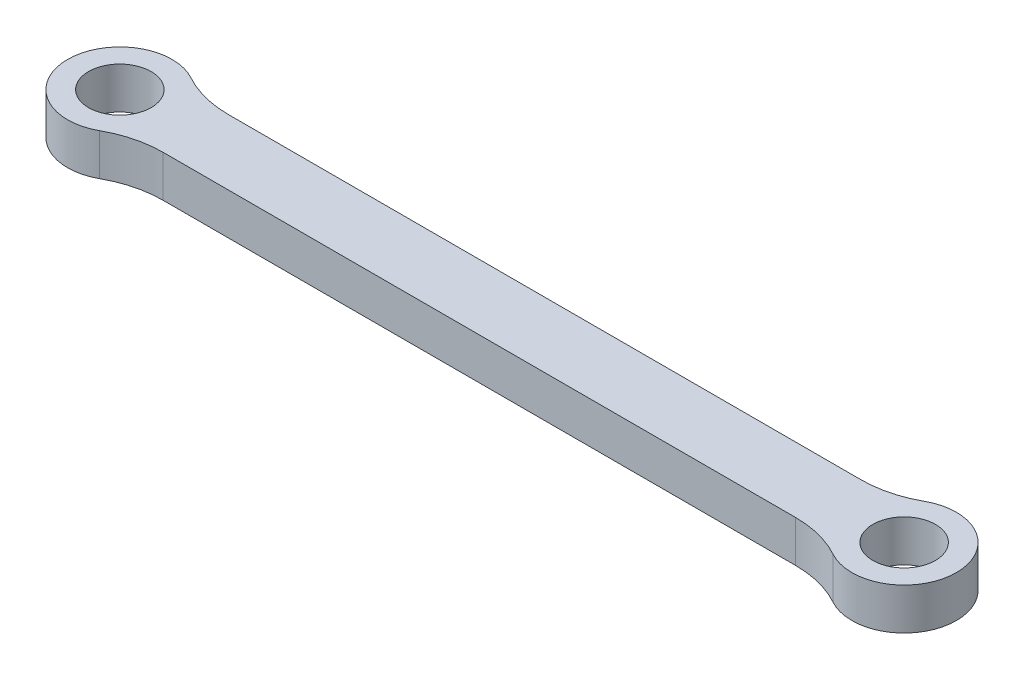
ISO-10303-21;
HEADER;
FILE_DESCRIPTION(('STEP AP214'),'2;1');
FILE_NAME('part.step','',(''),(''),'','','');
FILE_SCHEMA(('AUTOMOTIVE_DESIGN { 1 0 10303 214 1 1 1 1 }'));
ENDSEC;
DATA;
#1=APPLICATION_CONTEXT('core data for automotive mechanical design processes');
#2=APPLICATION_PROTOCOL_DEFINITION('international standard','automotive_design',2000,#1);
#3=PRODUCT_CONTEXT('',#1,'mechanical');
#4=PRODUCT('Part','Part','',(#3));
#5=PRODUCT_RELATED_PRODUCT_CATEGORY('part','',(#4));
#6=PRODUCT_DEFINITION_FORMATION('','',#4);
#7=PRODUCT_DEFINITION_CONTEXT('part definition',#1,'design');
#8=PRODUCT_DEFINITION('design','',#6,#7);
#9=PRODUCT_DEFINITION_SHAPE('','',#8);
#10=(LENGTH_UNIT() NAMED_UNIT(*) SI_UNIT(.MILLI.,.METRE.));
#11=(NAMED_UNIT(*) PLANE_ANGLE_UNIT() SI_UNIT($,.RADIAN.));
#12=(NAMED_UNIT(*) SI_UNIT($,.STERADIAN.) SOLID_ANGLE_UNIT());
#13=UNCERTAINTY_MEASURE_WITH_UNIT(LENGTH_MEASURE(1.E-05),#10,'distance_accuracy_value','');
#14=(GEOMETRIC_REPRESENTATION_CONTEXT(3) GLOBAL_UNCERTAINTY_ASSIGNED_CONTEXT((#13)) GLOBAL_UNIT_ASSIGNED_CONTEXT((#10,
#11,#12)) REPRESENTATION_CONTEXT('',''));
#15=CARTESIAN_POINT('',(0.,0.,0.));
#16=DIRECTION('',(0.,0.,1.));
#17=DIRECTION('',(1.,0.,0.));
#18=AXIS2_PLACEMENT_3D('',#15,#16,#17);
#19=CARTESIAN_POINT('',(-30.,3.18,-2.5));
#20=DIRECTION('',(0.,0.,1.));
#21=DIRECTION('',(1.,0.,0.));
#22=AXIS2_PLACEMENT_3D('',#19,#20,#21);
#23=PLANE('',#22);
#24=DIRECTION('',(-1.,0.,0.));
#25=VECTOR('',#24,1.);
#26=CARTESIAN_POINT('',(-30.,3.18,-2.5));
#27=LINE('',#26,#25);
#28=CARTESIAN_POINT('',(24.1905249806889,3.18,-2.5));
#29=VERTEX_POINT('',#28);
#30=CARTESIAN_POINT('',(-24.1905249806889,3.18,-2.5));
#31=VERTEX_POINT('',#30);
#32=EDGE_CURVE('E115',#29,#31,#27,.T.);
#33=ORIENTED_EDGE('',*,*,#32,.F.);
#34=DIRECTION('',(0.,1.,0.));
#35=VECTOR('',#34,1.);
#36=CARTESIAN_POINT('',(24.1905249806889,0.,-2.5));
#37=LINE('',#36,#35);
#38=CARTESIAN_POINT('',(24.1905249806889,0.,-2.5));
#39=VERTEX_POINT('',#38);
#40=EDGE_CURVE('E171',#29,#39,#37,.F.);
#41=ORIENTED_EDGE('',*,*,#40,.T.);
#42=DIRECTION('',(-1.,0.,0.));
#43=VECTOR('',#42,1.);
#44=CARTESIAN_POINT('',(-30.,0.,-2.5));
#45=LINE('',#44,#43);
#46=CARTESIAN_POINT('',(-24.1905249806889,0.,-2.5));
#47=VERTEX_POINT('',#46);
#48=EDGE_CURVE('E187',#39,#47,#45,.T.);
#49=ORIENTED_EDGE('',*,*,#48,.T.);
#50=DIRECTION('',(0.,1.,0.));
#51=VECTOR('',#50,1.);
#52=CARTESIAN_POINT('',(-24.1905249806889,3.18,-2.5));
#53=LINE('',#52,#51);
#54=EDGE_CURVE('E139',#47,#31,#53,.T.);
#55=ORIENTED_EDGE('',*,*,#54,.T.);
#56=EDGE_LOOP('',(#33,#41,#49,#55));
#57=FACE_BOUND('',#56,.T.);
#58=ADVANCED_FACE('F43',(#57),#23,.F.);
#59=CARTESIAN_POINT('',(-30.,3.18,2.5));
#60=DIRECTION('',(0.,0.,-1.));
#61=DIRECTION('',(-1.,0.,0.));
#62=AXIS2_PLACEMENT_3D('',#59,#60,#61);
#63=PLANE('',#62);
#64=DIRECTION('',(1.,0.,0.));
#65=VECTOR('',#64,1.);
#66=CARTESIAN_POINT('',(-30.,0.,2.5));
#67=LINE('',#66,#65);
#68=CARTESIAN_POINT('',(-24.1905249806889,0.,2.5));
#69=VERTEX_POINT('',#68);
#70=CARTESIAN_POINT('',(24.1905249806889,0.,2.5));
#71=VERTEX_POINT('',#70);
#72=EDGE_CURVE('E147',#69,#71,#67,.T.);
#73=ORIENTED_EDGE('',*,*,#72,.T.);
#74=DIRECTION('',(0.,1.,0.));
#75=VECTOR('',#74,1.);
#76=CARTESIAN_POINT('',(24.1905249806889,3.18,2.5));
#77=LINE('',#76,#75);
#78=CARTESIAN_POINT('',(24.1905249806889,3.18,2.5));
#79=VERTEX_POINT('',#78);
#80=EDGE_CURVE('E65',#71,#79,#77,.T.);
#81=ORIENTED_EDGE('',*,*,#80,.T.);
#82=DIRECTION('',(1.,0.,0.));
#83=VECTOR('',#82,1.);
#84=CARTESIAN_POINT('',(-30.,3.18,2.5));
#85=LINE('',#84,#83);
#86=CARTESIAN_POINT('',(-24.1905249806889,3.18,2.5));
#87=VERTEX_POINT('',#86);
#88=EDGE_CURVE('E140',#87,#79,#85,.T.);
#89=ORIENTED_EDGE('',*,*,#88,.F.);
#90=DIRECTION('',(0.,1.,0.));
#91=VECTOR('',#90,1.);
#92=CARTESIAN_POINT('',(-24.1905249806889,0.,2.5));
#93=LINE('',#92,#91);
#94=EDGE_CURVE('E154',#87,#69,#93,.F.);
#95=ORIENTED_EDGE('',*,*,#94,.T.);
#96=EDGE_LOOP('',(#73,#81,#89,#95));
#97=FACE_BOUND('',#96,.T.);
#98=ADVANCED_FACE('F228',(#97),#63,.F.);
#99=CARTESIAN_POINT('',(0.,3.18,0.));
#100=DIRECTION('',(0.,1.,0.));
#101=DIRECTION('',(0.,0.,1.));
#102=AXIS2_PLACEMENT_3D('',#99,#100,#101);
#103=PLANE('',#102);
#104=CARTESIAN_POINT('',(30.,3.18,0.));
#105=DIRECTION('',(0.,1.,0.));
#106=DIRECTION('',(0.,0.,1.));
#107=AXIS2_PLACEMENT_3D('',#104,#105,#106);
#108=CIRCLE('',#107,2.395);
#109=CARTESIAN_POINT('',(30.,3.18,2.395));
#110=VERTEX_POINT('',#109);
#111=EDGE_CURVE('E134',#110,#110,#108,.T.);
#112=ORIENTED_EDGE('',*,*,#111,.F.);
#113=EDGE_LOOP('',(#112));
#114=FACE_BOUND('',#113,.T.);
#115=CARTESIAN_POINT('',(-30.,3.18,0.));
#116=DIRECTION('',(0.,1.,0.));
#117=DIRECTION('',(0.,0.,1.));
#118=AXIS2_PLACEMENT_3D('',#115,#116,#117);
#119=CIRCLE('',#118,2.395);
#120=CARTESIAN_POINT('',(-30.,3.18,2.395));
#121=VERTEX_POINT('',#120);
#122=EDGE_CURVE('E219',#121,#121,#119,.T.);
#123=ORIENTED_EDGE('',*,*,#122,.F.);
#124=EDGE_LOOP('',(#123));
#125=FACE_BOUND('',#124,.T.);
#126=CARTESIAN_POINT('',(30.,3.18,0.));
#127=DIRECTION('',(0.,1.,0.));
#128=DIRECTION('',(0.,0.,1.));
#129=AXIS2_PLACEMENT_3D('',#126,#127,#128);
#130=CIRCLE('',#129,3.99999999999999);
#131=CARTESIAN_POINT('',(28.0635083268963,3.18,3.49999999999999));
#132=VERTEX_POINT('',#131);
#133=CARTESIAN_POINT('',(28.0635083268963,3.18,-3.5));
#134=VERTEX_POINT('',#133);
#135=EDGE_CURVE('E196',#132,#134,#130,.T.);
#136=ORIENTED_EDGE('',*,*,#135,.T.);
#137=CARTESIAN_POINT('',(24.1905249806889,3.18,-10.5));
#138=DIRECTION('',(0.,1.,0.));
#139=DIRECTION('',(0.,0.,1.));
#140=AXIS2_PLACEMENT_3D('',#137,#138,#139);
#141=CIRCLE('',#140,8.);
#142=EDGE_CURVE('E176',#134,#29,#141,.F.);
#143=ORIENTED_EDGE('',*,*,#142,.T.);
#144=ORIENTED_EDGE('',*,*,#32,.T.);
#145=CARTESIAN_POINT('',(-24.1905249806889,3.18,-10.5));
#146=DIRECTION('',(0.,1.,0.));
#147=DIRECTION('',(0.,0.,1.));
#148=AXIS2_PLACEMENT_3D('',#145,#146,#147);
#149=CIRCLE('',#148,8.);
#150=CARTESIAN_POINT('',(-28.0635083268963,3.18,-3.5));
#151=VERTEX_POINT('',#150);
#152=EDGE_CURVE('E109',#31,#151,#149,.F.);
#153=ORIENTED_EDGE('',*,*,#152,.T.);
#154=CARTESIAN_POINT('',(-30.,3.18,0.));
#155=DIRECTION('',(0.,1.,0.));
#156=DIRECTION('',(0.,0.,1.));
#157=AXIS2_PLACEMENT_3D('',#154,#155,#156);
#158=CIRCLE('',#157,4.);
#159=CARTESIAN_POINT('',(-28.0635083268963,3.18,3.5));
#160=VERTEX_POINT('',#159);
#161=EDGE_CURVE('E113',#151,#160,#158,.T.);
#162=ORIENTED_EDGE('',*,*,#161,.T.);
#163=CARTESIAN_POINT('',(-24.1905249806889,3.18,10.5));
#164=DIRECTION('',(0.,1.,0.));
#165=DIRECTION('',(0.,0.,1.));
#166=AXIS2_PLACEMENT_3D('',#163,#164,#165);
#167=CIRCLE('',#166,8.);
#168=EDGE_CURVE('E157',#160,#87,#167,.F.);
#169=ORIENTED_EDGE('',*,*,#168,.T.);
#170=ORIENTED_EDGE('',*,*,#88,.T.);
#171=CARTESIAN_POINT('',(24.1905249806889,3.18,10.5));
#172=DIRECTION('',(0.,1.,0.));
#173=DIRECTION('',(0.,0.,1.));
#174=AXIS2_PLACEMENT_3D('',#171,#172,#173);
#175=CIRCLE('',#174,8.);
#176=EDGE_CURVE('E11',#79,#132,#175,.F.);
#177=ORIENTED_EDGE('',*,*,#176,.T.);
#178=EDGE_LOOP('',(#136,#143,#144,#153,#162,#169,#170,#177));
#179=FACE_BOUND('',#178,.T.);
#180=ADVANCED_FACE('F112',(#114,#125,#179),#103,.T.);
#181=CARTESIAN_POINT('',(0.,0.,0.));
#182=DIRECTION('',(0.,1.,0.));
#183=DIRECTION('',(0.,0.,1.));
#184=AXIS2_PLACEMENT_3D('',#181,#182,#183);
#185=PLANE('',#184);
#186=CARTESIAN_POINT('',(30.,0.,0.));
#187=DIRECTION('',(0.,1.,0.));
#188=DIRECTION('',(0.,0.,1.));
#189=AXIS2_PLACEMENT_3D('',#186,#187,#188);
#190=CIRCLE('',#189,2.395);
#191=CARTESIAN_POINT('',(30.,0.,2.395));
#192=VERTEX_POINT('',#191);
#193=EDGE_CURVE('E211',#192,#192,#190,.T.);
#194=ORIENTED_EDGE('',*,*,#193,.T.);
#195=EDGE_LOOP('',(#194));
#196=FACE_BOUND('',#195,.T.);
#197=CARTESIAN_POINT('',(-30.,0.,0.));
#198=DIRECTION('',(0.,1.,0.));
#199=DIRECTION('',(0.,0.,1.));
#200=AXIS2_PLACEMENT_3D('',#197,#198,#199);
#201=CIRCLE('',#200,2.395);
#202=CARTESIAN_POINT('',(-30.,0.,2.395));
#203=VERTEX_POINT('',#202);
#204=EDGE_CURVE('E215',#203,#203,#201,.T.);
#205=ORIENTED_EDGE('',*,*,#204,.T.);
#206=EDGE_LOOP('',(#205));
#207=FACE_BOUND('',#206,.T.);
#208=ORIENTED_EDGE('',*,*,#72,.F.);
#209=CARTESIAN_POINT('',(-24.1905249806889,0.,10.5));
#210=DIRECTION('',(0.,1.,0.));
#211=DIRECTION('',(0.,0.,1.));
#212=AXIS2_PLACEMENT_3D('',#209,#210,#211);
#213=CIRCLE('',#212,8.);
#214=CARTESIAN_POINT('',(-28.0635083268963,0.,3.5));
#215=VERTEX_POINT('',#214);
#216=EDGE_CURVE('E160',#69,#215,#213,.T.);
#217=ORIENTED_EDGE('',*,*,#216,.T.);
#218=CARTESIAN_POINT('',(-30.,0.,0.));
#219=DIRECTION('',(0.,1.,0.));
#220=DIRECTION('',(0.,0.,1.));
#221=AXIS2_PLACEMENT_3D('',#218,#219,#220);
#222=CIRCLE('',#221,4.);
#223=CARTESIAN_POINT('',(-28.0635083268963,0.,-3.5));
#224=VERTEX_POINT('',#223);
#225=EDGE_CURVE('E133',#224,#215,#222,.T.);
#226=ORIENTED_EDGE('',*,*,#225,.F.);
#227=CARTESIAN_POINT('',(-24.1905249806889,0.,-10.5));
#228=DIRECTION('',(0.,1.,0.));
#229=DIRECTION('',(0.,0.,1.));
#230=AXIS2_PLACEMENT_3D('',#227,#228,#229);
#231=CIRCLE('',#230,8.);
#232=EDGE_CURVE('E122',#224,#47,#231,.T.);
#233=ORIENTED_EDGE('',*,*,#232,.T.);
#234=ORIENTED_EDGE('',*,*,#48,.F.);
#235=CARTESIAN_POINT('',(24.1905249806889,0.,-10.5));
#236=DIRECTION('',(0.,1.,0.));
#237=DIRECTION('',(0.,0.,1.));
#238=AXIS2_PLACEMENT_3D('',#235,#236,#237);
#239=CIRCLE('',#238,8.);
#240=CARTESIAN_POINT('',(28.0635083268963,0.,-3.5));
#241=VERTEX_POINT('',#240);
#242=EDGE_CURVE('E179',#39,#241,#239,.T.);
#243=ORIENTED_EDGE('',*,*,#242,.T.);
#244=CARTESIAN_POINT('',(30.,0.,0.));
#245=DIRECTION('',(0.,1.,0.));
#246=DIRECTION('',(0.,0.,1.));
#247=AXIS2_PLACEMENT_3D('',#244,#245,#246);
#248=CIRCLE('',#247,3.99999999999999);
#249=CARTESIAN_POINT('',(28.0635083268963,0.,3.49999999999999));
#250=VERTEX_POINT('',#249);
#251=EDGE_CURVE('E186',#250,#241,#248,.T.);
#252=ORIENTED_EDGE('',*,*,#251,.F.);
#253=CARTESIAN_POINT('',(24.1905249806889,0.,10.5));
#254=DIRECTION('',(0.,1.,0.));
#255=DIRECTION('',(0.,0.,1.));
#256=AXIS2_PLACEMENT_3D('',#253,#254,#255);
#257=CIRCLE('',#256,8.);
#258=EDGE_CURVE('E52',#250,#71,#257,.T.);
#259=ORIENTED_EDGE('',*,*,#258,.T.);
#260=EDGE_LOOP('',(#208,#217,#226,#233,#234,#243,#252,#259));
#261=FACE_BOUND('',#260,.T.);
#262=ADVANCED_FACE('F185',(#196,#207,#261),#185,.F.);
#263=CARTESIAN_POINT('',(30.,14.4937084989848,0.));
#264=DIRECTION('',(0.,-1.,0.));
#265=DIRECTION('',(0.,0.,-1.));
#266=AXIS2_PLACEMENT_3D('',#263,#264,#265);
#267=CYLINDRICAL_SURFACE('',#266,3.99999999999999);
#268=ORIENTED_EDGE('',*,*,#251,.T.);
#269=DIRECTION('',(0.,-1.,0.));
#270=VECTOR('',#269,1.);
#271=CARTESIAN_POINT('',(28.0635083268963,14.4937084989848,-3.49999999999999));
#272=LINE('',#271,#270);
#273=EDGE_CURVE('E167',#241,#134,#272,.F.);
#274=ORIENTED_EDGE('',*,*,#273,.T.);
#275=ORIENTED_EDGE('',*,*,#135,.F.);
#276=DIRECTION('',(0.,-1.,0.));
#277=VECTOR('',#276,1.);
#278=CARTESIAN_POINT('',(28.0635083268963,14.4937084989848,3.49999999999999));
#279=LINE('',#278,#277);
#280=EDGE_CURVE('E163',#132,#250,#279,.T.);
#281=ORIENTED_EDGE('',*,*,#280,.T.);
#282=EDGE_LOOP('',(#268,#274,#275,#281));
#283=FACE_BOUND('',#282,.T.);
#284=ADVANCED_FACE('F192',(#283),#267,.T.);
#285=CARTESIAN_POINT('',(-30.,14.4937084989848,0.));
#286=DIRECTION('',(0.,-1.,0.));
#287=DIRECTION('',(0.,0.,-1.));
#288=AXIS2_PLACEMENT_3D('',#285,#286,#287);
#289=CYLINDRICAL_SURFACE('',#288,4.);
#290=ORIENTED_EDGE('',*,*,#225,.T.);
#291=DIRECTION('',(0.,-1.,0.));
#292=VECTOR('',#291,1.);
#293=CARTESIAN_POINT('',(-28.0635083268963,14.4937084989848,3.5));
#294=LINE('',#293,#292);
#295=EDGE_CURVE('E121',#215,#160,#294,.F.);
#296=ORIENTED_EDGE('',*,*,#295,.T.);
#297=ORIENTED_EDGE('',*,*,#161,.F.);
#298=DIRECTION('',(0.,-1.,0.));
#299=VECTOR('',#298,1.);
#300=CARTESIAN_POINT('',(-28.0635083268963,14.4937084989848,-3.5));
#301=LINE('',#300,#299);
#302=EDGE_CURVE('E129',#151,#224,#301,.T.);
#303=ORIENTED_EDGE('',*,*,#302,.T.);
#304=EDGE_LOOP('',(#290,#296,#297,#303));
#305=FACE_BOUND('',#304,.T.);
#306=ADVANCED_FACE('F128',(#305),#289,.T.);
#307=CARTESIAN_POINT('',(-30.,9.95408296376712,0.));
#308=DIRECTION('',(0.,-1.,0.));
#309=DIRECTION('',(0.,0.,-1.));
#310=AXIS2_PLACEMENT_3D('',#307,#308,#309);
#311=CYLINDRICAL_SURFACE('',#310,2.395);
#312=ORIENTED_EDGE('',*,*,#204,.F.);
#313=EDGE_LOOP('',(#312));
#314=FACE_BOUND('',#313,.T.);
#315=ORIENTED_EDGE('',*,*,#122,.T.);
#316=EDGE_LOOP('',(#315));
#317=FACE_BOUND('',#316,.T.);
#318=ADVANCED_FACE('F225',(#314,#317),#311,.F.);
#319=CARTESIAN_POINT('',(30.,9.95408296376712,0.));
#320=DIRECTION('',(0.,-1.,0.));
#321=DIRECTION('',(0.,0.,-1.));
#322=AXIS2_PLACEMENT_3D('',#319,#320,#321);
#323=CYLINDRICAL_SURFACE('',#322,2.395);
#324=ORIENTED_EDGE('',*,*,#193,.F.);
#325=EDGE_LOOP('',(#324));
#326=FACE_BOUND('',#325,.T.);
#327=ORIENTED_EDGE('',*,*,#111,.T.);
#328=EDGE_LOOP('',(#327));
#329=FACE_BOUND('',#328,.T.);
#330=ADVANCED_FACE('F248',(#326,#329),#323,.F.);
#331=CARTESIAN_POINT('',(-24.1905249806889,14.4937084989848,-10.5));
#332=DIRECTION('',(0.,-1.,0.));
#333=DIRECTION('',(0.,0.,-1.));
#334=AXIS2_PLACEMENT_3D('',#331,#332,#333);
#335=CYLINDRICAL_SURFACE('',#334,8.);
#336=ORIENTED_EDGE('',*,*,#152,.F.);
#337=ORIENTED_EDGE('',*,*,#54,.F.);
#338=ORIENTED_EDGE('',*,*,#232,.F.);
#339=ORIENTED_EDGE('',*,*,#302,.F.);
#340=EDGE_LOOP('',(#336,#337,#338,#339));
#341=FACE_BOUND('',#340,.T.);
#342=ADVANCED_FACE('F136',(#341),#335,.F.);
#343=CARTESIAN_POINT('',(-24.1905249806889,14.4937084989848,10.5));
#344=DIRECTION('',(0.,-1.,0.));
#345=DIRECTION('',(0.,0.,-1.));
#346=AXIS2_PLACEMENT_3D('',#343,#344,#345);
#347=CYLINDRICAL_SURFACE('',#346,8.);
#348=ORIENTED_EDGE('',*,*,#216,.F.);
#349=ORIENTED_EDGE('',*,*,#94,.F.);
#350=ORIENTED_EDGE('',*,*,#168,.F.);
#351=ORIENTED_EDGE('',*,*,#295,.F.);
#352=EDGE_LOOP('',(#348,#349,#350,#351));
#353=FACE_BOUND('',#352,.T.);
#354=ADVANCED_FACE('F247',(#353),#347,.F.);
#355=CARTESIAN_POINT('',(24.1905249806889,14.4937084989848,-10.5));
#356=DIRECTION('',(0.,-1.,0.));
#357=DIRECTION('',(0.,0.,-1.));
#358=AXIS2_PLACEMENT_3D('',#355,#356,#357);
#359=CYLINDRICAL_SURFACE('',#358,8.);
#360=ORIENTED_EDGE('',*,*,#242,.F.);
#361=ORIENTED_EDGE('',*,*,#40,.F.);
#362=ORIENTED_EDGE('',*,*,#142,.F.);
#363=ORIENTED_EDGE('',*,*,#273,.F.);
#364=EDGE_LOOP('',(#360,#361,#362,#363));
#365=FACE_BOUND('',#364,.T.);
#366=ADVANCED_FACE('F198',(#365),#359,.F.);
#367=CARTESIAN_POINT('',(24.1905249806889,14.4937084989848,10.5));
#368=DIRECTION('',(0.,-1.,0.));
#369=DIRECTION('',(0.,0.,-1.));
#370=AXIS2_PLACEMENT_3D('',#367,#368,#369);
#371=CYLINDRICAL_SURFACE('',#370,8.);
#372=ORIENTED_EDGE('',*,*,#176,.F.);
#373=ORIENTED_EDGE('',*,*,#80,.F.);
#374=ORIENTED_EDGE('',*,*,#258,.F.);
#375=ORIENTED_EDGE('',*,*,#280,.F.);
#376=EDGE_LOOP('',(#372,#373,#374,#375));
#377=FACE_BOUND('',#376,.T.);
#378=ADVANCED_FACE('F45',(#377),#371,.F.);
#379=CLOSED_SHELL('',(#58,#98,#180,#262,#284,#306,#318,#330,#342,#354,#366,#378));
#380=MANIFOLD_SOLID_BREP('B2',#379);
#381=ADVANCED_BREP_SHAPE_REPRESENTATION('',(#18,#380),#14);
#382=SHAPE_DEFINITION_REPRESENTATION(#9,#381);
ENDSEC;
END-ISO-10303-21;
